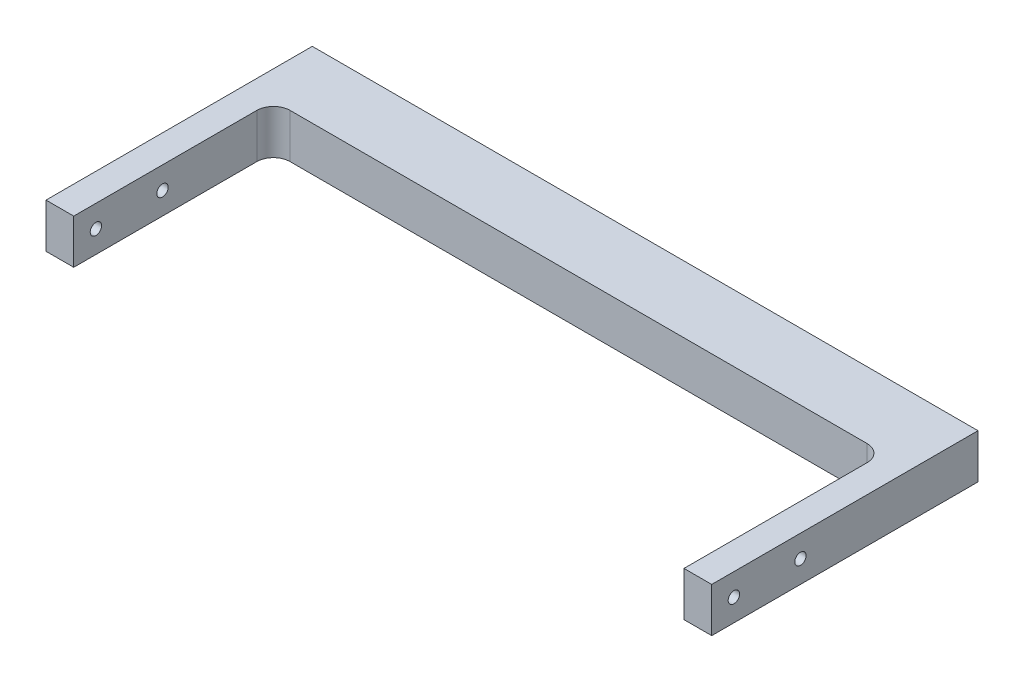
ISO-10303-21;
HEADER;
FILE_DESCRIPTION(('STEP AP214'),'2;1');
FILE_NAME('part.step','',(''),(''),'','','');
FILE_SCHEMA(('AUTOMOTIVE_DESIGN { 1 0 10303 214 1 1 1 1 }'));
ENDSEC;
DATA;
#1=APPLICATION_CONTEXT('core data for automotive mechanical design processes');
#2=APPLICATION_PROTOCOL_DEFINITION('international standard','automotive_design',2000,#1);
#3=PRODUCT_CONTEXT('',#1,'mechanical');
#4=PRODUCT('Part','Part','',(#3));
#5=PRODUCT_RELATED_PRODUCT_CATEGORY('part','',(#4));
#6=PRODUCT_DEFINITION_FORMATION('','',#4);
#7=PRODUCT_DEFINITION_CONTEXT('part definition',#1,'design');
#8=PRODUCT_DEFINITION('design','',#6,#7);
#9=PRODUCT_DEFINITION_SHAPE('','',#8);
#10=(LENGTH_UNIT() NAMED_UNIT(*) SI_UNIT(.MILLI.,.METRE.));
#11=(NAMED_UNIT(*) PLANE_ANGLE_UNIT() SI_UNIT($,.RADIAN.));
#12=(NAMED_UNIT(*) SI_UNIT($,.STERADIAN.) SOLID_ANGLE_UNIT());
#13=UNCERTAINTY_MEASURE_WITH_UNIT(LENGTH_MEASURE(1.E-05),#10,'distance_accuracy_value','');
#14=(GEOMETRIC_REPRESENTATION_CONTEXT(3) GLOBAL_UNCERTAINTY_ASSIGNED_CONTEXT((#13)) GLOBAL_UNIT_ASSIGNED_CONTEXT((#10,
#11,#12)) REPRESENTATION_CONTEXT('',''));
#15=CARTESIAN_POINT('',(0.,0.,0.));
#16=DIRECTION('',(0.,0.,1.));
#17=DIRECTION('',(1.,0.,0.));
#18=AXIS2_PLACEMENT_3D('',#15,#16,#17);
#19=CARTESIAN_POINT('',(-190.5,25.4000000000001,0.));
#20=DIRECTION('',(1.,0.,0.));
#21=DIRECTION('',(0.,0.,-1.));
#22=AXIS2_PLACEMENT_3D('',#19,#20,#21);
#23=PLANE('',#22);
#24=CARTESIAN_POINT('',(-190.5,12.6999999999999,101.6));
#25=DIRECTION('',(-1.,0.,0.));
#26=DIRECTION('',(0.,0.,1.));
#27=AXIS2_PLACEMENT_3D('',#24,#25,#26);
#28=CIRCLE('',#27,3.26389999999999);
#29=CARTESIAN_POINT('',(-190.5,12.6999999999999,104.8639));
#30=VERTEX_POINT('',#29);
#31=EDGE_CURVE('E242',#30,#30,#28,.T.);
#32=ORIENTED_EDGE('',*,*,#31,.F.);
#33=EDGE_LOOP('',(#32));
#34=FACE_BOUND('',#33,.T.);
#35=CARTESIAN_POINT('',(-190.5,12.6999999999999,139.7));
#36=DIRECTION('',(-1.,0.,0.));
#37=DIRECTION('',(0.,0.,1.));
#38=AXIS2_PLACEMENT_3D('',#35,#36,#37);
#39=CIRCLE('',#38,3.26389999999999);
#40=CARTESIAN_POINT('',(-190.5,12.6999999999999,142.9639));
#41=VERTEX_POINT('',#40);
#42=EDGE_CURVE('E245',#41,#41,#39,.T.);
#43=ORIENTED_EDGE('',*,*,#42,.F.);
#44=EDGE_LOOP('',(#43));
#45=FACE_BOUND('',#44,.T.);
#46=DIRECTION('',(0.,0.,1.));
#47=VECTOR('',#46,1.);
#48=CARTESIAN_POINT('',(-190.5,0.,0.));
#49=LINE('',#48,#47);
#50=CARTESIAN_POINT('',(-190.5,0.,0.));
#51=VERTEX_POINT('',#50);
#52=CARTESIAN_POINT('',(-190.5,0.,152.4));
#53=VERTEX_POINT('',#52);
#54=EDGE_CURVE('E127',#51,#53,#49,.T.);
#55=ORIENTED_EDGE('',*,*,#54,.T.);
#56=DIRECTION('',(0.,-1.,0.));
#57=VECTOR('',#56,1.);
#58=CARTESIAN_POINT('',(-190.5,25.4000000000001,152.4));
#59=LINE('',#58,#57);
#60=CARTESIAN_POINT('',(-190.5,25.4000000000001,152.4));
#61=VERTEX_POINT('',#60);
#62=EDGE_CURVE('E134',#61,#53,#59,.T.);
#63=ORIENTED_EDGE('',*,*,#62,.F.);
#64=DIRECTION('',(0.,0.,1.));
#65=VECTOR('',#64,1.);
#66=CARTESIAN_POINT('',(-190.5,25.4000000000001,0.));
#67=LINE('',#66,#65);
#68=CARTESIAN_POINT('',(-190.5,25.4000000000001,0.));
#69=VERTEX_POINT('',#68);
#70=EDGE_CURVE('E165',#69,#61,#67,.T.);
#71=ORIENTED_EDGE('',*,*,#70,.F.);
#72=DIRECTION('',(0.,-1.,0.));
#73=VECTOR('',#72,1.);
#74=CARTESIAN_POINT('',(-190.5,25.4000000000001,0.));
#75=LINE('',#74,#73);
#76=EDGE_CURVE('E145',#69,#51,#75,.T.);
#77=ORIENTED_EDGE('',*,*,#76,.T.);
#78=EDGE_LOOP('',(#55,#63,#71,#77));
#79=FACE_BOUND('',#78,.T.);
#80=ADVANCED_FACE('F48',(#34,#45,#79),#23,.F.);
#81=CARTESIAN_POINT('',(-190.5,25.4000000000001,152.4));
#82=DIRECTION('',(0.,0.,-1.));
#83=DIRECTION('',(-1.,0.,0.));
#84=AXIS2_PLACEMENT_3D('',#81,#82,#83);
#85=PLANE('',#84);
#86=DIRECTION('',(1.,0.,0.));
#87=VECTOR('',#86,1.);
#88=CARTESIAN_POINT('',(-190.5,0.,152.4));
#89=LINE('',#88,#87);
#90=CARTESIAN_POINT('',(-174.625,0.,152.4));
#91=VERTEX_POINT('',#90);
#92=EDGE_CURVE('E122',#53,#91,#89,.T.);
#93=ORIENTED_EDGE('',*,*,#92,.T.);
#94=DIRECTION('',(0.,-1.,0.));
#95=VECTOR('',#94,1.);
#96=CARTESIAN_POINT('',(-174.625,25.4000000000001,152.4));
#97=LINE('',#96,#95);
#98=CARTESIAN_POINT('',(-174.625,25.4000000000001,152.4));
#99=VERTEX_POINT('',#98);
#100=EDGE_CURVE('E141',#99,#91,#97,.T.);
#101=ORIENTED_EDGE('',*,*,#100,.F.);
#102=DIRECTION('',(1.,0.,0.));
#103=VECTOR('',#102,1.);
#104=CARTESIAN_POINT('',(-190.5,25.4000000000001,152.4));
#105=LINE('',#104,#103);
#106=EDGE_CURVE('E136',#61,#99,#105,.T.);
#107=ORIENTED_EDGE('',*,*,#106,.F.);
#108=ORIENTED_EDGE('',*,*,#62,.T.);
#109=EDGE_LOOP('',(#93,#101,#107,#108));
#110=FACE_BOUND('',#109,.T.);
#111=ADVANCED_FACE('F135',(#110),#85,.F.);
#112=CARTESIAN_POINT('',(-174.625,25.4000000000001,152.4));
#113=DIRECTION('',(-1.,0.,0.));
#114=DIRECTION('',(0.,0.,1.));
#115=AXIS2_PLACEMENT_3D('',#112,#113,#114);
#116=PLANE('',#115);
#117=CARTESIAN_POINT('',(-174.625,12.6999999999999,101.6));
#118=DIRECTION('',(-1.,0.,0.));
#119=DIRECTION('',(0.,0.,1.));
#120=AXIS2_PLACEMENT_3D('',#117,#118,#119);
#121=CIRCLE('',#120,3.26389999999999);
#122=CARTESIAN_POINT('',(-174.625,12.6999999999999,104.8639));
#123=VERTEX_POINT('',#122);
#124=EDGE_CURVE('E248',#123,#123,#121,.T.);
#125=ORIENTED_EDGE('',*,*,#124,.T.);
#126=EDGE_LOOP('',(#125));
#127=FACE_BOUND('',#126,.T.);
#128=CARTESIAN_POINT('',(-174.625,12.6999999999999,139.7));
#129=DIRECTION('',(-1.,0.,0.));
#130=DIRECTION('',(0.,0.,1.));
#131=AXIS2_PLACEMENT_3D('',#128,#129,#130);
#132=CIRCLE('',#131,3.26389999999999);
#133=CARTESIAN_POINT('',(-174.625,12.6999999999999,142.9639));
#134=VERTEX_POINT('',#133);
#135=EDGE_CURVE('E247',#134,#134,#132,.T.);
#136=ORIENTED_EDGE('',*,*,#135,.T.);
#137=EDGE_LOOP('',(#136));
#138=FACE_BOUND('',#137,.T.);
#139=DIRECTION('',(0.,0.,-1.));
#140=VECTOR('',#139,1.);
#141=CARTESIAN_POINT('',(-174.625,0.,152.4));
#142=LINE('',#141,#140);
#143=CARTESIAN_POINT('',(-174.625,0.,47.625));
#144=VERTEX_POINT('',#143);
#145=EDGE_CURVE('E128',#91,#144,#142,.T.);
#146=ORIENTED_EDGE('',*,*,#145,.T.);
#147=DIRECTION('',(0.,-1.,0.));
#148=VECTOR('',#147,1.);
#149=CARTESIAN_POINT('',(-174.625,25.4000000000001,47.625));
#150=LINE('',#149,#148);
#151=CARTESIAN_POINT('',(-174.625,25.4000000000001,47.625));
#152=VERTEX_POINT('',#151);
#153=EDGE_CURVE('E62',#144,#152,#150,.F.);
#154=ORIENTED_EDGE('',*,*,#153,.T.);
#155=DIRECTION('',(0.,0.,-1.));
#156=VECTOR('',#155,1.);
#157=CARTESIAN_POINT('',(-174.625,25.4000000000001,152.4));
#158=LINE('',#157,#156);
#159=EDGE_CURVE('E168',#99,#152,#158,.T.);
#160=ORIENTED_EDGE('',*,*,#159,.F.);
#161=ORIENTED_EDGE('',*,*,#100,.T.);
#162=EDGE_LOOP('',(#146,#154,#160,#161));
#163=FACE_BOUND('',#162,.T.);
#164=ADVANCED_FACE('F224',(#127,#138,#163),#116,.F.);
#165=CARTESIAN_POINT('',(-174.625,25.4000000000001,38.1));
#166=DIRECTION('',(0.,0.,-1.));
#167=DIRECTION('',(-1.,0.,0.));
#168=AXIS2_PLACEMENT_3D('',#165,#166,#167);
#169=PLANE('',#168);
#170=DIRECTION('',(1.,0.,0.));
#171=VECTOR('',#170,1.);
#172=CARTESIAN_POINT('',(-174.625,0.,38.1));
#173=LINE('',#172,#171);
#174=CARTESIAN_POINT('',(-165.1,0.,38.1));
#175=VERTEX_POINT('',#174);
#176=CARTESIAN_POINT('',(165.1,0.,38.1));
#177=VERTEX_POINT('',#176);
#178=EDGE_CURVE('E154',#175,#177,#173,.T.);
#179=ORIENTED_EDGE('',*,*,#178,.T.);
#180=DIRECTION('',(0.,-1.,0.));
#181=VECTOR('',#180,1.);
#182=CARTESIAN_POINT('',(165.1,25.4000000000001,38.1));
#183=LINE('',#182,#181);
#184=CARTESIAN_POINT('',(165.1,25.4000000000001,38.1));
#185=VERTEX_POINT('',#184);
#186=EDGE_CURVE('E197',#177,#185,#183,.F.);
#187=ORIENTED_EDGE('',*,*,#186,.T.);
#188=DIRECTION('',(1.,0.,0.));
#189=VECTOR('',#188,1.);
#190=CARTESIAN_POINT('',(-174.625,25.4000000000001,38.1));
#191=LINE('',#190,#189);
#192=CARTESIAN_POINT('',(-165.1,25.4000000000001,38.1));
#193=VERTEX_POINT('',#192);
#194=EDGE_CURVE('E170',#193,#185,#191,.T.);
#195=ORIENTED_EDGE('',*,*,#194,.F.);
#196=DIRECTION('',(0.,-1.,0.));
#197=VECTOR('',#196,1.);
#198=CARTESIAN_POINT('',(-165.1,0.,38.1));
#199=LINE('',#198,#197);
#200=EDGE_CURVE('E194',#193,#175,#199,.T.);
#201=ORIENTED_EDGE('',*,*,#200,.T.);
#202=EDGE_LOOP('',(#179,#187,#195,#201));
#203=FACE_BOUND('',#202,.T.);
#204=ADVANCED_FACE('F219',(#203),#169,.F.);
#205=CARTESIAN_POINT('',(174.625,25.4000000000001,152.4));
#206=DIRECTION('',(1.,0.,0.));
#207=DIRECTION('',(0.,0.,-1.));
#208=AXIS2_PLACEMENT_3D('',#205,#206,#207);
#209=PLANE('',#208);
#210=CARTESIAN_POINT('',(174.625,12.6999999999999,139.7));
#211=DIRECTION('',(1.,0.,0.));
#212=DIRECTION('',(0.,0.,-1.));
#213=AXIS2_PLACEMENT_3D('',#210,#211,#212);
#214=CIRCLE('',#213,3.26389999999999);
#215=CARTESIAN_POINT('',(174.625,12.6999999999999,136.4361));
#216=VERTEX_POINT('',#215);
#217=EDGE_CURVE('E258',#216,#216,#214,.T.);
#218=ORIENTED_EDGE('',*,*,#217,.T.);
#219=EDGE_LOOP('',(#218));
#220=FACE_BOUND('',#219,.T.);
#221=CARTESIAN_POINT('',(174.625,12.6999999999999,101.6));
#222=DIRECTION('',(1.,0.,0.));
#223=DIRECTION('',(0.,0.,-1.));
#224=AXIS2_PLACEMENT_3D('',#221,#222,#223);
#225=CIRCLE('',#224,3.26389999999999);
#226=CARTESIAN_POINT('',(174.625,12.6999999999999,98.3361));
#227=VERTEX_POINT('',#226);
#228=EDGE_CURVE('E146',#227,#227,#225,.T.);
#229=ORIENTED_EDGE('',*,*,#228,.T.);
#230=EDGE_LOOP('',(#229));
#231=FACE_BOUND('',#230,.T.);
#232=DIRECTION('',(0.,0.,1.));
#233=VECTOR('',#232,1.);
#234=CARTESIAN_POINT('',(174.625,25.4000000000001,152.4));
#235=LINE('',#234,#233);
#236=CARTESIAN_POINT('',(174.625,25.4000000000001,47.625));
#237=VERTEX_POINT('',#236);
#238=CARTESIAN_POINT('',(174.625,25.4000000000001,152.4));
#239=VERTEX_POINT('',#238);
#240=EDGE_CURVE('E173',#237,#239,#235,.T.);
#241=ORIENTED_EDGE('',*,*,#240,.F.);
#242=DIRECTION('',(0.,-1.,0.));
#243=VECTOR('',#242,1.);
#244=CARTESIAN_POINT('',(174.625,0.,47.625));
#245=LINE('',#244,#243);
#246=CARTESIAN_POINT('',(174.625,0.,47.625));
#247=VERTEX_POINT('',#246);
#248=EDGE_CURVE('E140',#237,#247,#245,.T.);
#249=ORIENTED_EDGE('',*,*,#248,.T.);
#250=DIRECTION('',(0.,0.,1.));
#251=VECTOR('',#250,1.);
#252=CARTESIAN_POINT('',(174.625,0.,152.4));
#253=LINE('',#252,#251);
#254=CARTESIAN_POINT('',(174.625,0.,152.4));
#255=VERTEX_POINT('',#254);
#256=EDGE_CURVE('E157',#247,#255,#253,.T.);
#257=ORIENTED_EDGE('',*,*,#256,.T.);
#258=DIRECTION('',(0.,-1.,0.));
#259=VECTOR('',#258,1.);
#260=CARTESIAN_POINT('',(174.625,25.4000000000001,152.4));
#261=LINE('',#260,#259);
#262=EDGE_CURVE('E188',#239,#255,#261,.T.);
#263=ORIENTED_EDGE('',*,*,#262,.F.);
#264=EDGE_LOOP('',(#241,#249,#257,#263));
#265=FACE_BOUND('',#264,.T.);
#266=ADVANCED_FACE('F213',(#220,#231,#265),#209,.F.);
#267=CARTESIAN_POINT('',(174.625,25.4000000000001,152.4));
#268=DIRECTION('',(0.,0.,-1.));
#269=DIRECTION('',(-1.,0.,0.));
#270=AXIS2_PLACEMENT_3D('',#267,#268,#269);
#271=PLANE('',#270);
#272=DIRECTION('',(1.,0.,0.));
#273=VECTOR('',#272,1.);
#274=CARTESIAN_POINT('',(174.625,0.,152.4));
#275=LINE('',#274,#273);
#276=CARTESIAN_POINT('',(190.5,0.,152.4));
#277=VERTEX_POINT('',#276);
#278=EDGE_CURVE('E159',#255,#277,#275,.T.);
#279=ORIENTED_EDGE('',*,*,#278,.T.);
#280=DIRECTION('',(0.,-1.,0.));
#281=VECTOR('',#280,1.);
#282=CARTESIAN_POINT('',(190.5,25.4000000000001,152.4));
#283=LINE('',#282,#281);
#284=CARTESIAN_POINT('',(190.5,25.4000000000001,152.4));
#285=VERTEX_POINT('',#284);
#286=EDGE_CURVE('E185',#285,#277,#283,.T.);
#287=ORIENTED_EDGE('',*,*,#286,.F.);
#288=DIRECTION('',(1.,0.,0.));
#289=VECTOR('',#288,1.);
#290=CARTESIAN_POINT('',(174.625,25.4000000000001,152.4));
#291=LINE('',#290,#289);
#292=EDGE_CURVE('E175',#239,#285,#291,.T.);
#293=ORIENTED_EDGE('',*,*,#292,.F.);
#294=ORIENTED_EDGE('',*,*,#262,.T.);
#295=EDGE_LOOP('',(#279,#287,#293,#294));
#296=FACE_BOUND('',#295,.T.);
#297=ADVANCED_FACE('F269',(#296),#271,.F.);
#298=CARTESIAN_POINT('',(190.5,25.4000000000001,0.));
#299=DIRECTION('',(-1.,0.,0.));
#300=DIRECTION('',(0.,0.,1.));
#301=AXIS2_PLACEMENT_3D('',#298,#299,#300);
#302=PLANE('',#301);
#303=CARTESIAN_POINT('',(190.5,12.6999999999999,139.7));
#304=DIRECTION('',(1.,0.,0.));
#305=DIRECTION('',(0.,0.,-1.));
#306=AXIS2_PLACEMENT_3D('',#303,#304,#305);
#307=CIRCLE('',#306,3.26389999999999);
#308=CARTESIAN_POINT('',(190.5,12.6999999999999,136.4361));
#309=VERTEX_POINT('',#308);
#310=EDGE_CURVE('E251',#309,#309,#307,.T.);
#311=ORIENTED_EDGE('',*,*,#310,.F.);
#312=EDGE_LOOP('',(#311));
#313=FACE_BOUND('',#312,.T.);
#314=CARTESIAN_POINT('',(190.5,12.6999999999999,101.6));
#315=DIRECTION('',(1.,0.,0.));
#316=DIRECTION('',(0.,0.,-1.));
#317=AXIS2_PLACEMENT_3D('',#314,#315,#316);
#318=CIRCLE('',#317,3.26389999999999);
#319=CARTESIAN_POINT('',(190.5,12.6999999999999,98.3361));
#320=VERTEX_POINT('',#319);
#321=EDGE_CURVE('E149',#320,#320,#318,.T.);
#322=ORIENTED_EDGE('',*,*,#321,.F.);
#323=EDGE_LOOP('',(#322));
#324=FACE_BOUND('',#323,.T.);
#325=DIRECTION('',(0.,0.,-1.));
#326=VECTOR('',#325,1.);
#327=CARTESIAN_POINT('',(190.5,0.,0.));
#328=LINE('',#327,#326);
#329=CARTESIAN_POINT('',(190.5,0.,0.));
#330=VERTEX_POINT('',#329);
#331=EDGE_CURVE('E161',#277,#330,#328,.T.);
#332=ORIENTED_EDGE('',*,*,#331,.T.);
#333=DIRECTION('',(0.,-1.,0.));
#334=VECTOR('',#333,1.);
#335=CARTESIAN_POINT('',(190.5,25.4000000000001,0.));
#336=LINE('',#335,#334);
#337=CARTESIAN_POINT('',(190.5,25.4000000000001,0.));
#338=VERTEX_POINT('',#337);
#339=EDGE_CURVE('E182',#338,#330,#336,.T.);
#340=ORIENTED_EDGE('',*,*,#339,.F.);
#341=DIRECTION('',(0.,0.,-1.));
#342=VECTOR('',#341,1.);
#343=CARTESIAN_POINT('',(190.5,25.4000000000001,0.));
#344=LINE('',#343,#342);
#345=EDGE_CURVE('E177',#285,#338,#344,.T.);
#346=ORIENTED_EDGE('',*,*,#345,.F.);
#347=ORIENTED_EDGE('',*,*,#286,.T.);
#348=EDGE_LOOP('',(#332,#340,#346,#347));
#349=FACE_BOUND('',#348,.T.);
#350=ADVANCED_FACE('F265',(#313,#324,#349),#302,.F.);
#351=CARTESIAN_POINT('',(-190.5,25.4000000000001,0.));
#352=DIRECTION('',(0.,0.,1.));
#353=DIRECTION('',(1.,0.,0.));
#354=AXIS2_PLACEMENT_3D('',#351,#352,#353);
#355=PLANE('',#354);
#356=DIRECTION('',(-1.,0.,0.));
#357=VECTOR('',#356,1.);
#358=CARTESIAN_POINT('',(-190.5,0.,0.));
#359=LINE('',#358,#357);
#360=EDGE_CURVE('E163',#330,#51,#359,.T.);
#361=ORIENTED_EDGE('',*,*,#360,.T.);
#362=ORIENTED_EDGE('',*,*,#76,.F.);
#363=DIRECTION('',(-1.,0.,0.));
#364=VECTOR('',#363,1.);
#365=CARTESIAN_POINT('',(-190.5,25.4000000000001,0.));
#366=LINE('',#365,#364);
#367=EDGE_CURVE('E179',#338,#69,#366,.T.);
#368=ORIENTED_EDGE('',*,*,#367,.F.);
#369=ORIENTED_EDGE('',*,*,#339,.T.);
#370=EDGE_LOOP('',(#361,#362,#368,#369));
#371=FACE_BOUND('',#370,.T.);
#372=ADVANCED_FACE('F268',(#371),#355,.F.);
#373=CARTESIAN_POINT('',(-190.5,25.4000000000001,152.4));
#374=DIRECTION('',(0.,1.,0.));
#375=DIRECTION('',(0.,0.,1.));
#376=AXIS2_PLACEMENT_3D('',#373,#374,#375);
#377=PLANE('',#376);
#378=ORIENTED_EDGE('',*,*,#70,.T.);
#379=ORIENTED_EDGE('',*,*,#106,.T.);
#380=ORIENTED_EDGE('',*,*,#159,.T.);
#381=CARTESIAN_POINT('',(-165.1,25.4000000000001,47.625));
#382=DIRECTION('',(0.,1.,0.));
#383=DIRECTION('',(0.,0.,1.));
#384=AXIS2_PLACEMENT_3D('',#381,#382,#383);
#385=CIRCLE('',#384,9.525);
#386=EDGE_CURVE('E13',#152,#193,#385,.F.);
#387=ORIENTED_EDGE('',*,*,#386,.T.);
#388=ORIENTED_EDGE('',*,*,#194,.T.);
#389=CARTESIAN_POINT('',(165.1,25.4000000000001,47.625));
#390=DIRECTION('',(0.,1.,0.));
#391=DIRECTION('',(0.,0.,1.));
#392=AXIS2_PLACEMENT_3D('',#389,#390,#391);
#393=CIRCLE('',#392,9.525);
#394=EDGE_CURVE('E202',#185,#237,#393,.F.);
#395=ORIENTED_EDGE('',*,*,#394,.T.);
#396=ORIENTED_EDGE('',*,*,#240,.T.);
#397=ORIENTED_EDGE('',*,*,#292,.T.);
#398=ORIENTED_EDGE('',*,*,#345,.T.);
#399=ORIENTED_EDGE('',*,*,#367,.T.);
#400=EDGE_LOOP('',(#378,#379,#380,#387,#388,#395,#396,#397,#398,#399));
#401=FACE_BOUND('',#400,.T.);
#402=ADVANCED_FACE('F206',(#401),#377,.T.);
#403=CARTESIAN_POINT('',(-190.5,0.,152.4));
#404=DIRECTION('',(0.,1.,0.));
#405=DIRECTION('',(0.,0.,1.));
#406=AXIS2_PLACEMENT_3D('',#403,#404,#405);
#407=PLANE('',#406);
#408=ORIENTED_EDGE('',*,*,#54,.F.);
#409=ORIENTED_EDGE('',*,*,#360,.F.);
#410=ORIENTED_EDGE('',*,*,#331,.F.);
#411=ORIENTED_EDGE('',*,*,#278,.F.);
#412=ORIENTED_EDGE('',*,*,#256,.F.);
#413=CARTESIAN_POINT('',(165.1,0.,47.625));
#414=DIRECTION('',(0.,1.,0.));
#415=DIRECTION('',(0.,0.,1.));
#416=AXIS2_PLACEMENT_3D('',#413,#414,#415);
#417=CIRCLE('',#416,9.525);
#418=EDGE_CURVE('E200',#247,#177,#417,.T.);
#419=ORIENTED_EDGE('',*,*,#418,.T.);
#420=ORIENTED_EDGE('',*,*,#178,.F.);
#421=CARTESIAN_POINT('',(-165.1,0.,47.625));
#422=DIRECTION('',(0.,1.,0.));
#423=DIRECTION('',(0.,0.,1.));
#424=AXIS2_PLACEMENT_3D('',#421,#422,#423);
#425=CIRCLE('',#424,9.525);
#426=EDGE_CURVE('E55',#175,#144,#425,.T.);
#427=ORIENTED_EDGE('',*,*,#426,.T.);
#428=ORIENTED_EDGE('',*,*,#145,.F.);
#429=ORIENTED_EDGE('',*,*,#92,.F.);
#430=EDGE_LOOP('',(#408,#409,#410,#411,#412,#419,#420,#427,#428,#429));
#431=FACE_BOUND('',#430,.T.);
#432=ADVANCED_FACE('F124',(#431),#407,.F.);
#433=CARTESIAN_POINT('',(165.1,25.4000000000001,47.625));
#434=DIRECTION('',(0.,1.,0.));
#435=DIRECTION('',(0.,0.,1.));
#436=AXIS2_PLACEMENT_3D('',#433,#434,#435);
#437=CYLINDRICAL_SURFACE('',#436,9.525);
#438=ORIENTED_EDGE('',*,*,#394,.F.);
#439=ORIENTED_EDGE('',*,*,#186,.F.);
#440=ORIENTED_EDGE('',*,*,#418,.F.);
#441=ORIENTED_EDGE('',*,*,#248,.F.);
#442=EDGE_LOOP('',(#438,#439,#440,#441));
#443=FACE_BOUND('',#442,.T.);
#444=ADVANCED_FACE('F216',(#443),#437,.F.);
#445=CARTESIAN_POINT('',(-165.1,25.4000000000001,47.625));
#446=DIRECTION('',(0.,1.,0.));
#447=DIRECTION('',(0.,0.,1.));
#448=AXIS2_PLACEMENT_3D('',#445,#446,#447);
#449=CYLINDRICAL_SURFACE('',#448,9.525);
#450=ORIENTED_EDGE('',*,*,#386,.F.);
#451=ORIENTED_EDGE('',*,*,#153,.F.);
#452=ORIENTED_EDGE('',*,*,#426,.F.);
#453=ORIENTED_EDGE('',*,*,#200,.F.);
#454=EDGE_LOOP('',(#450,#451,#452,#453));
#455=FACE_BOUND('',#454,.T.);
#456=ADVANCED_FACE('F223',(#455),#449,.F.);
#457=CARTESIAN_POINT('',(190.5,12.6999999999999,101.6));
#458=DIRECTION('',(1.,0.,0.));
#459=DIRECTION('',(0.,0.,-1.));
#460=AXIS2_PLACEMENT_3D('',#457,#458,#459);
#461=CYLINDRICAL_SURFACE('',#460,3.26389999999999);
#462=ORIENTED_EDGE('',*,*,#228,.F.);
#463=EDGE_LOOP('',(#462));
#464=FACE_BOUND('',#463,.T.);
#465=ORIENTED_EDGE('',*,*,#321,.T.);
#466=EDGE_LOOP('',(#465));
#467=FACE_BOUND('',#466,.T.);
#468=ADVANCED_FACE('F263',(#464,#467),#461,.F.);
#469=CARTESIAN_POINT('',(190.5,12.6999999999999,139.7));
#470=DIRECTION('',(1.,0.,0.));
#471=DIRECTION('',(0.,0.,-1.));
#472=AXIS2_PLACEMENT_3D('',#469,#470,#471);
#473=CYLINDRICAL_SURFACE('',#472,3.26389999999999);
#474=ORIENTED_EDGE('',*,*,#217,.F.);
#475=EDGE_LOOP('',(#474));
#476=FACE_BOUND('',#475,.T.);
#477=ORIENTED_EDGE('',*,*,#310,.T.);
#478=EDGE_LOOP('',(#477));
#479=FACE_BOUND('',#478,.T.);
#480=ADVANCED_FACE('F299',(#476,#479),#473,.F.);
#481=CARTESIAN_POINT('',(-190.5,12.6999999999999,139.7));
#482=DIRECTION('',(-1.,0.,0.));
#483=DIRECTION('',(0.,0.,1.));
#484=AXIS2_PLACEMENT_3D('',#481,#482,#483);
#485=CYLINDRICAL_SURFACE('',#484,3.26389999999999);
#486=ORIENTED_EDGE('',*,*,#135,.F.);
#487=EDGE_LOOP('',(#486));
#488=FACE_BOUND('',#487,.T.);
#489=ORIENTED_EDGE('',*,*,#42,.T.);
#490=EDGE_LOOP('',(#489));
#491=FACE_BOUND('',#490,.T.);
#492=ADVANCED_FACE('F303',(#488,#491),#485,.F.);
#493=CARTESIAN_POINT('',(-190.5,12.6999999999999,101.6));
#494=DIRECTION('',(-1.,0.,0.));
#495=DIRECTION('',(0.,0.,1.));
#496=AXIS2_PLACEMENT_3D('',#493,#494,#495);
#497=CYLINDRICAL_SURFACE('',#496,3.26389999999999);
#498=ORIENTED_EDGE('',*,*,#124,.F.);
#499=EDGE_LOOP('',(#498));
#500=FACE_BOUND('',#499,.T.);
#501=ORIENTED_EDGE('',*,*,#31,.T.);
#502=EDGE_LOOP('',(#501));
#503=FACE_BOUND('',#502,.T.);
#504=ADVANCED_FACE('F307',(#500,#503),#497,.F.);
#505=CLOSED_SHELL('',(#80,#111,#164,#204,#266,#297,#350,#372,#402,#432,#444,#456,#468,#480,#492,#504));
#506=MANIFOLD_SOLID_BREP('B2',#505);
#507=ADVANCED_BREP_SHAPE_REPRESENTATION('',(#18,#506),#14);
#508=SHAPE_DEFINITION_REPRESENTATION(#9,#507);
ENDSEC;
END-ISO-10303-21;
